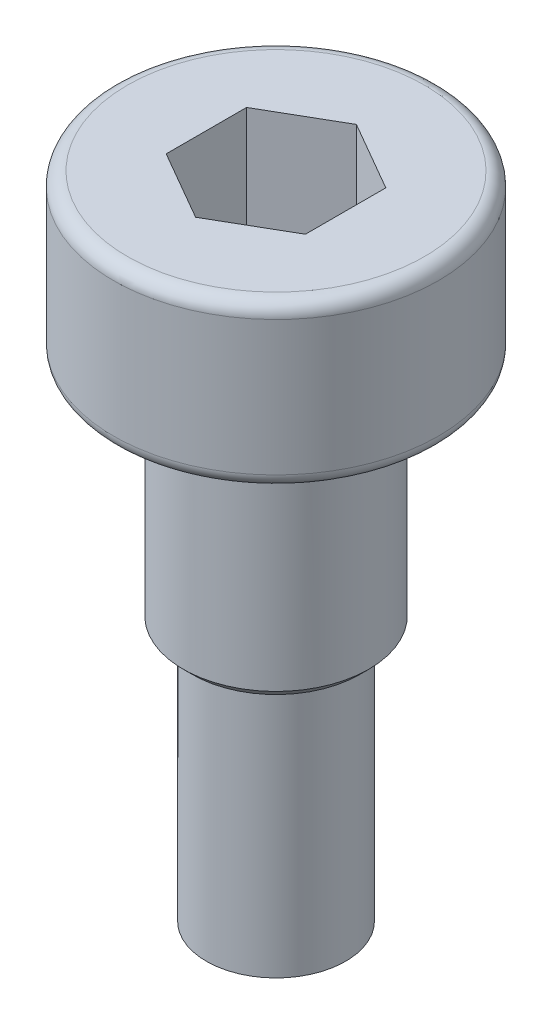
ISO-10303-21;
HEADER;
FILE_DESCRIPTION(('STEP AP214'),'2;1');
FILE_NAME('part.step','',(''),(''),'','','');
FILE_SCHEMA(('AUTOMOTIVE_DESIGN { 1 0 10303 214 1 1 1 1 }'));
ENDSEC;
DATA;
#1=APPLICATION_CONTEXT('core data for automotive mechanical design processes');
#2=APPLICATION_PROTOCOL_DEFINITION('international standard','automotive_design',2000,#1);
#3=PRODUCT_CONTEXT('',#1,'mechanical');
#4=PRODUCT('Part','Part','',(#3));
#5=PRODUCT_RELATED_PRODUCT_CATEGORY('part','',(#4));
#6=PRODUCT_DEFINITION_FORMATION('','',#4);
#7=PRODUCT_DEFINITION_CONTEXT('part definition',#1,'design');
#8=PRODUCT_DEFINITION('design','',#6,#7);
#9=PRODUCT_DEFINITION_SHAPE('','',#8);
#10=(LENGTH_UNIT() NAMED_UNIT(*) SI_UNIT(.MILLI.,.METRE.));
#11=(NAMED_UNIT(*) PLANE_ANGLE_UNIT() SI_UNIT($,.RADIAN.));
#12=(NAMED_UNIT(*) SI_UNIT($,.STERADIAN.) SOLID_ANGLE_UNIT());
#13=UNCERTAINTY_MEASURE_WITH_UNIT(LENGTH_MEASURE(1.E-05),#10,'distance_accuracy_value','');
#14=(GEOMETRIC_REPRESENTATION_CONTEXT(3) GLOBAL_UNCERTAINTY_ASSIGNED_CONTEXT((#13)) GLOBAL_UNIT_ASSIGNED_CONTEXT((#10,
#11,#12)) REPRESENTATION_CONTEXT('',''));
#15=CARTESIAN_POINT('',(0.,0.,0.));
#16=DIRECTION('',(0.,0.,1.));
#17=DIRECTION('',(1.,0.,0.));
#18=AXIS2_PLACEMENT_3D('',#15,#16,#17);
#19=CARTESIAN_POINT('',(0.,3.5,0.));
#20=DIRECTION('',(0.,1.,0.));
#21=DIRECTION('',(-1.,0.,0.));
#22=AXIS2_PLACEMENT_3D('',#19,#20,#21);
#23=PLANE('',#22);
#24=DIRECTION('',(0.866025403784439,0.,-0.5));
#25=VECTOR('',#24,1.);
#26=CARTESIAN_POINT('',(0.,3.5,1.73205080756888));
#27=LINE('',#26,#25);
#28=CARTESIAN_POINT('',(0.,3.5,1.73205080756888));
#29=VERTEX_POINT('',#28);
#30=CARTESIAN_POINT('',(1.5,3.5,0.866025403784439));
#31=VERTEX_POINT('',#30);
#32=EDGE_CURVE('E59',#29,#31,#27,.T.);
#33=ORIENTED_EDGE('',*,*,#32,.F.);
#34=DIRECTION('',(0.866025403784438,0.,0.5));
#35=VECTOR('',#34,1.);
#36=CARTESIAN_POINT('',(-1.5,3.5,0.866025403784438));
#37=LINE('',#36,#35);
#38=CARTESIAN_POINT('',(-1.5,3.5,0.866025403784438));
#39=VERTEX_POINT('',#38);
#40=EDGE_CURVE('E142',#39,#29,#37,.T.);
#41=ORIENTED_EDGE('',*,*,#40,.F.);
#42=DIRECTION('',(0.,0.,1.));
#43=VECTOR('',#42,1.);
#44=CARTESIAN_POINT('',(-1.5,3.5,-0.866025403784439));
#45=LINE('',#44,#43);
#46=CARTESIAN_POINT('',(-1.5,3.5,-0.866025403784439));
#47=VERTEX_POINT('',#46);
#48=EDGE_CURVE('E140',#47,#39,#45,.T.);
#49=ORIENTED_EDGE('',*,*,#48,.F.);
#50=DIRECTION('',(-0.866025403784439,0.,0.5));
#51=VECTOR('',#50,1.);
#52=CARTESIAN_POINT('',(0.,3.5,-1.73205080756888));
#53=LINE('',#52,#51);
#54=CARTESIAN_POINT('',(0.,3.5,-1.73205080756888));
#55=VERTEX_POINT('',#54);
#56=EDGE_CURVE('E107',#55,#47,#53,.T.);
#57=ORIENTED_EDGE('',*,*,#56,.F.);
#58=DIRECTION('',(-0.866025403784439,0.,-0.5));
#59=VECTOR('',#58,1.);
#60=CARTESIAN_POINT('',(1.5,3.5,-0.866025403784439));
#61=LINE('',#60,#59);
#62=CARTESIAN_POINT('',(1.5,3.5,-0.866025403784439));
#63=VERTEX_POINT('',#62);
#64=EDGE_CURVE('E136',#63,#55,#61,.T.);
#65=ORIENTED_EDGE('',*,*,#64,.F.);
#66=DIRECTION('',(0.,0.,-1.));
#67=VECTOR('',#66,1.);
#68=CARTESIAN_POINT('',(1.5,3.5,0.866025403784439));
#69=LINE('',#68,#67);
#70=EDGE_CURVE('E133',#31,#63,#69,.T.);
#71=ORIENTED_EDGE('',*,*,#70,.F.);
#72=EDGE_LOOP('',(#33,#41,#49,#57,#65,#71));
#73=FACE_BOUND('',#72,.T.);
#74=CARTESIAN_POINT('',(0.,3.5,0.));
#75=DIRECTION('',(0.,1.,0.));
#76=DIRECTION('',(-1.,0.,0.));
#77=AXIS2_PLACEMENT_3D('',#74,#75,#76);
#78=CIRCLE('',#77,3.2);
#79=CARTESIAN_POINT('',(-3.2,3.5,0.));
#80=VERTEX_POINT('',#79);
#81=EDGE_CURVE('E169',#80,#80,#78,.T.);
#82=ORIENTED_EDGE('',*,*,#81,.T.);
#83=EDGE_LOOP('',(#82));
#84=FACE_BOUND('',#83,.T.);
#85=ADVANCED_FACE('F43',(#73,#84),#23,.T.);
#86=CARTESIAN_POINT('',(0.,3.5,0.));
#87=DIRECTION('',(0.,1.,0.));
#88=DIRECTION('',(-1.,0.,0.));
#89=AXIS2_PLACEMENT_3D('',#86,#87,#88);
#90=CYLINDRICAL_SURFACE('',#89,3.5);
#91=CARTESIAN_POINT('',(0.,0.3,0.));
#92=DIRECTION('',(0.,-1.,0.));
#93=DIRECTION('',(1.,0.,0.));
#94=AXIS2_PLACEMENT_3D('',#91,#92,#93);
#95=CIRCLE('',#94,3.5);
#96=CARTESIAN_POINT('',(3.5,0.3,0.));
#97=VERTEX_POINT('',#96);
#98=EDGE_CURVE('E163',#97,#97,#95,.F.);
#99=ORIENTED_EDGE('',*,*,#98,.T.);
#100=EDGE_LOOP('',(#99));
#101=FACE_BOUND('',#100,.T.);
#102=CARTESIAN_POINT('',(0.,3.2,0.));
#103=DIRECTION('',(0.,1.,0.));
#104=DIRECTION('',(-1.,0.,0.));
#105=AXIS2_PLACEMENT_3D('',#102,#103,#104);
#106=CIRCLE('',#105,3.5);
#107=CARTESIAN_POINT('',(-3.5,3.2,0.));
#108=VERTEX_POINT('',#107);
#109=EDGE_CURVE('E160',#108,#108,#106,.F.);
#110=ORIENTED_EDGE('',*,*,#109,.T.);
#111=EDGE_LOOP('',(#110));
#112=FACE_BOUND('',#111,.T.);
#113=ADVANCED_FACE('F186',(#101,#112),#90,.T.);
#114=CARTESIAN_POINT('',(-3.5,0.,0.));
#115=DIRECTION('',(0.,-1.,0.));
#116=DIRECTION('',(1.,0.,0.));
#117=AXIS2_PLACEMENT_3D('',#114,#115,#116);
#118=PLANE('',#117);
#119=CARTESIAN_POINT('',(0.,0.,0.));
#120=DIRECTION('',(0.,-1.,0.));
#121=DIRECTION('',(1.,0.,0.));
#122=AXIS2_PLACEMENT_3D('',#119,#120,#121);
#123=CIRCLE('',#122,3.2);
#124=CARTESIAN_POINT('',(3.2,0.,0.));
#125=VERTEX_POINT('',#124);
#126=EDGE_CURVE('E166',#125,#125,#123,.T.);
#127=ORIENTED_EDGE('',*,*,#126,.T.);
#128=EDGE_LOOP('',(#127));
#129=FACE_BOUND('',#128,.T.);
#130=CARTESIAN_POINT('',(0.,0.,0.));
#131=DIRECTION('',(0.,1.,0.));
#132=DIRECTION('',(-1.,0.,0.));
#133=AXIS2_PLACEMENT_3D('',#130,#131,#132);
#134=CIRCLE('',#133,2.);
#135=CARTESIAN_POINT('',(-2.,0.,0.));
#136=VERTEX_POINT('',#135);
#137=EDGE_CURVE('E157',#136,#136,#134,.T.);
#138=ORIENTED_EDGE('',*,*,#137,.T.);
#139=EDGE_LOOP('',(#138));
#140=FACE_BOUND('',#139,.T.);
#141=ADVANCED_FACE('F192',(#129,#140),#118,.T.);
#142=CARTESIAN_POINT('',(0.,3.5,0.));
#143=DIRECTION('',(0.,1.,0.));
#144=DIRECTION('',(-1.,0.,0.));
#145=AXIS2_PLACEMENT_3D('',#142,#143,#144);
#146=CYLINDRICAL_SURFACE('',#145,2.);
#147=CARTESIAN_POINT('',(0.,-4.8,0.));
#148=DIRECTION('',(0.,-1.,0.));
#149=DIRECTION('',(1.,0.,0.));
#150=AXIS2_PLACEMENT_3D('',#147,#148,#149);
#151=CIRCLE('',#150,2.);
#152=CARTESIAN_POINT('',(2.,-4.8,0.));
#153=VERTEX_POINT('',#152);
#154=EDGE_CURVE('E52',#153,#153,#151,.F.);
#155=ORIENTED_EDGE('',*,*,#154,.T.);
#156=EDGE_LOOP('',(#155));
#157=FACE_BOUND('',#156,.T.);
#158=ORIENTED_EDGE('',*,*,#137,.F.);
#159=EDGE_LOOP('',(#158));
#160=FACE_BOUND('',#159,.T.);
#161=ADVANCED_FACE('F174',(#157,#160),#146,.T.);
#162=CARTESIAN_POINT('',(-2.,-5.,0.));
#163=DIRECTION('',(0.,-1.,0.));
#164=DIRECTION('',(1.,0.,0.));
#165=AXIS2_PLACEMENT_3D('',#162,#163,#164);
#166=PLANE('',#165);
#167=CARTESIAN_POINT('',(0.,-5.,0.));
#168=DIRECTION('',(0.,-1.,0.));
#169=DIRECTION('',(1.,0.,0.));
#170=AXIS2_PLACEMENT_3D('',#167,#168,#169);
#171=CIRCLE('',#170,1.8);
#172=CARTESIAN_POINT('',(1.8,-5.,0.));
#173=VERTEX_POINT('',#172);
#174=EDGE_CURVE('E11',#173,#173,#171,.T.);
#175=ORIENTED_EDGE('',*,*,#174,.T.);
#176=EDGE_LOOP('',(#175));
#177=FACE_BOUND('',#176,.T.);
#178=CARTESIAN_POINT('',(0.,-5.,0.));
#179=DIRECTION('',(0.,1.,0.));
#180=DIRECTION('',(-1.,0.,0.));
#181=AXIS2_PLACEMENT_3D('',#178,#179,#180);
#182=CIRCLE('',#181,1.5);
#183=CARTESIAN_POINT('',(-1.5,-5.,0.));
#184=VERTEX_POINT('',#183);
#185=EDGE_CURVE('E154',#184,#184,#182,.T.);
#186=ORIENTED_EDGE('',*,*,#185,.T.);
#187=EDGE_LOOP('',(#186));
#188=FACE_BOUND('',#187,.T.);
#189=ADVANCED_FACE('F228',(#177,#188),#166,.T.);
#190=CARTESIAN_POINT('',(0.,3.5,0.));
#191=DIRECTION('',(0.,1.,0.));
#192=DIRECTION('',(-1.,0.,0.));
#193=AXIS2_PLACEMENT_3D('',#190,#191,#192);
#194=CYLINDRICAL_SURFACE('',#193,1.5);
#195=CARTESIAN_POINT('',(0.,-10.5,0.));
#196=DIRECTION('',(0.,1.,0.));
#197=DIRECTION('',(-1.,0.,0.));
#198=AXIS2_PLACEMENT_3D('',#195,#196,#197);
#199=CIRCLE('',#198,1.5);
#200=CARTESIAN_POINT('',(-1.5,-10.5,0.));
#201=VERTEX_POINT('',#200);
#202=EDGE_CURVE('E146',#201,#201,#199,.T.);
#203=ORIENTED_EDGE('',*,*,#202,.T.);
#204=EDGE_LOOP('',(#203));
#205=FACE_BOUND('',#204,.T.);
#206=ORIENTED_EDGE('',*,*,#185,.F.);
#207=EDGE_LOOP('',(#206));
#208=FACE_BOUND('',#207,.T.);
#209=ADVANCED_FACE('F224',(#205,#208),#194,.T.);
#210=CARTESIAN_POINT('',(-1.5,-10.5,0.));
#211=DIRECTION('',(0.,-1.,0.));
#212=DIRECTION('',(1.,0.,0.));
#213=AXIS2_PLACEMENT_3D('',#210,#211,#212);
#214=PLANE('',#213);
#215=ORIENTED_EDGE('',*,*,#202,.F.);
#216=EDGE_LOOP('',(#215));
#217=FACE_BOUND('',#216,.T.);
#218=ADVANCED_FACE('F201',(#217),#214,.T.);
#219=CARTESIAN_POINT('',(0.,0.3,0.));
#220=DIRECTION('',(0.,-1.,0.));
#221=DIRECTION('',(1.,0.,0.));
#222=AXIS2_PLACEMENT_3D('',#219,#220,#221);
#223=TOROIDAL_SURFACE('',#222,3.2,0.3);
#224=ORIENTED_EDGE('',*,*,#126,.F.);
#225=EDGE_LOOP('',(#224));
#226=FACE_BOUND('',#225,.T.);
#227=ORIENTED_EDGE('',*,*,#98,.F.);
#228=EDGE_LOOP('',(#227));
#229=FACE_BOUND('',#228,.T.);
#230=ADVANCED_FACE('F198',(#226,#229),#223,.T.);
#231=CARTESIAN_POINT('',(0.,3.2,0.));
#232=DIRECTION('',(0.,1.,0.));
#233=DIRECTION('',(-1.,0.,0.));
#234=AXIS2_PLACEMENT_3D('',#231,#232,#233);
#235=TOROIDAL_SURFACE('',#234,3.2,0.3);
#236=ORIENTED_EDGE('',*,*,#109,.F.);
#237=EDGE_LOOP('',(#236));
#238=FACE_BOUND('',#237,.T.);
#239=ORIENTED_EDGE('',*,*,#81,.F.);
#240=EDGE_LOOP('',(#239));
#241=FACE_BOUND('',#240,.T.);
#242=ADVANCED_FACE('F200',(#238,#241),#235,.T.);
#243=CARTESIAN_POINT('',(0.,1.1,1.73205080756888));
#244=DIRECTION('',(0.5,0.,0.866025403784439));
#245=DIRECTION('',(0.866025403784439,0.,-0.5));
#246=AXIS2_PLACEMENT_3D('',#243,#244,#245);
#247=PLANE('',#246);
#248=ORIENTED_EDGE('',*,*,#32,.T.);
#249=DIRECTION('',(0.,1.,0.));
#250=VECTOR('',#249,1.);
#251=CARTESIAN_POINT('',(1.5,1.1,0.866025403784439));
#252=LINE('',#251,#250);
#253=CARTESIAN_POINT('',(1.5,1.1,0.866025403784439));
#254=VERTEX_POINT('',#253);
#255=EDGE_CURVE('E89',#254,#31,#252,.T.);
#256=ORIENTED_EDGE('',*,*,#255,.F.);
#257=DIRECTION('',(0.866025403784439,0.,-0.5));
#258=VECTOR('',#257,1.);
#259=CARTESIAN_POINT('',(0.,1.1,1.73205080756888));
#260=LINE('',#259,#258);
#261=CARTESIAN_POINT('',(0.,1.1,1.73205080756888));
#262=VERTEX_POINT('',#261);
#263=EDGE_CURVE('E144',#262,#254,#260,.T.);
#264=ORIENTED_EDGE('',*,*,#263,.F.);
#265=DIRECTION('',(0.,1.,0.));
#266=VECTOR('',#265,1.);
#267=CARTESIAN_POINT('',(0.,1.1,1.73205080756888));
#268=LINE('',#267,#266);
#269=EDGE_CURVE('E67',#262,#29,#268,.T.);
#270=ORIENTED_EDGE('',*,*,#269,.T.);
#271=EDGE_LOOP('',(#248,#256,#264,#270));
#272=FACE_BOUND('',#271,.T.);
#273=ADVANCED_FACE('F204',(#272),#247,.F.);
#274=CARTESIAN_POINT('',(-1.5,1.1,0.866025403784438));
#275=DIRECTION('',(-0.5,0.,0.866025403784439));
#276=DIRECTION('',(0.866025403784439,0.,0.5));
#277=AXIS2_PLACEMENT_3D('',#274,#275,#276);
#278=PLANE('',#277);
#279=ORIENTED_EDGE('',*,*,#40,.T.);
#280=ORIENTED_EDGE('',*,*,#269,.F.);
#281=DIRECTION('',(0.866025403784438,0.,0.5));
#282=VECTOR('',#281,1.);
#283=CARTESIAN_POINT('',(-1.5,1.1,0.866025403784438));
#284=LINE('',#283,#282);
#285=CARTESIAN_POINT('',(-1.5,1.1,0.866025403784438));
#286=VERTEX_POINT('',#285);
#287=EDGE_CURVE('E119',#286,#262,#284,.T.);
#288=ORIENTED_EDGE('',*,*,#287,.F.);
#289=DIRECTION('',(0.,1.,0.));
#290=VECTOR('',#289,1.);
#291=CARTESIAN_POINT('',(-1.5,1.1,0.866025403784438));
#292=LINE('',#291,#290);
#293=EDGE_CURVE('E111',#286,#39,#292,.T.);
#294=ORIENTED_EDGE('',*,*,#293,.T.);
#295=EDGE_LOOP('',(#279,#280,#288,#294));
#296=FACE_BOUND('',#295,.T.);
#297=ADVANCED_FACE('F209',(#296),#278,.F.);
#298=CARTESIAN_POINT('',(-1.5,1.1,-0.866025403784439));
#299=DIRECTION('',(-1.,0.,0.));
#300=DIRECTION('',(0.,-1.,0.));
#301=AXIS2_PLACEMENT_3D('',#298,#299,#300);
#302=PLANE('',#301);
#303=ORIENTED_EDGE('',*,*,#48,.T.);
#304=ORIENTED_EDGE('',*,*,#293,.F.);
#305=DIRECTION('',(0.,0.,1.));
#306=VECTOR('',#305,1.);
#307=CARTESIAN_POINT('',(-1.5,1.1,-0.866025403784439));
#308=LINE('',#307,#306);
#309=CARTESIAN_POINT('',(-1.5,1.1,-0.866025403784439));
#310=VERTEX_POINT('',#309);
#311=EDGE_CURVE('E115',#310,#286,#308,.T.);
#312=ORIENTED_EDGE('',*,*,#311,.F.);
#313=DIRECTION('',(0.,1.,0.));
#314=VECTOR('',#313,1.);
#315=CARTESIAN_POINT('',(-1.5,1.1,-0.866025403784439));
#316=LINE('',#315,#314);
#317=EDGE_CURVE('E100',#310,#47,#316,.T.);
#318=ORIENTED_EDGE('',*,*,#317,.T.);
#319=EDGE_LOOP('',(#303,#304,#312,#318));
#320=FACE_BOUND('',#319,.T.);
#321=ADVANCED_FACE('F116',(#320),#302,.F.);
#322=CARTESIAN_POINT('',(0.,1.1,-1.73205080756888));
#323=DIRECTION('',(-0.5,0.,-0.866025403784439));
#324=DIRECTION('',(-0.866025403784439,0.,0.5));
#325=AXIS2_PLACEMENT_3D('',#322,#323,#324);
#326=PLANE('',#325);
#327=ORIENTED_EDGE('',*,*,#56,.T.);
#328=ORIENTED_EDGE('',*,*,#317,.F.);
#329=DIRECTION('',(-0.866025403784439,0.,0.5));
#330=VECTOR('',#329,1.);
#331=CARTESIAN_POINT('',(0.,1.1,-1.73205080756888));
#332=LINE('',#331,#330);
#333=CARTESIAN_POINT('',(0.,1.1,-1.73205080756888));
#334=VERTEX_POINT('',#333);
#335=EDGE_CURVE('E104',#334,#310,#332,.T.);
#336=ORIENTED_EDGE('',*,*,#335,.F.);
#337=DIRECTION('',(0.,1.,0.));
#338=VECTOR('',#337,1.);
#339=CARTESIAN_POINT('',(0.,1.1,-1.73205080756888));
#340=LINE('',#339,#338);
#341=EDGE_CURVE('E112',#334,#55,#340,.T.);
#342=ORIENTED_EDGE('',*,*,#341,.T.);
#343=EDGE_LOOP('',(#327,#328,#336,#342));
#344=FACE_BOUND('',#343,.T.);
#345=ADVANCED_FACE('F102',(#344),#326,.F.);
#346=CARTESIAN_POINT('',(1.5,1.1,-0.866025403784439));
#347=DIRECTION('',(0.5,0.,-0.866025403784439));
#348=DIRECTION('',(-0.866025403784439,0.,-0.5));
#349=AXIS2_PLACEMENT_3D('',#346,#347,#348);
#350=PLANE('',#349);
#351=ORIENTED_EDGE('',*,*,#64,.T.);
#352=ORIENTED_EDGE('',*,*,#341,.F.);
#353=DIRECTION('',(-0.866025403784439,0.,-0.5));
#354=VECTOR('',#353,1.);
#355=CARTESIAN_POINT('',(1.5,1.1,-0.866025403784439));
#356=LINE('',#355,#354);
#357=CARTESIAN_POINT('',(1.5,1.1,-0.866025403784439));
#358=VERTEX_POINT('',#357);
#359=EDGE_CURVE('E125',#358,#334,#356,.T.);
#360=ORIENTED_EDGE('',*,*,#359,.F.);
#361=DIRECTION('',(0.,1.,0.));
#362=VECTOR('',#361,1.);
#363=CARTESIAN_POINT('',(1.5,1.1,-0.866025403784439));
#364=LINE('',#363,#362);
#365=EDGE_CURVE('E149',#358,#63,#364,.T.);
#366=ORIENTED_EDGE('',*,*,#365,.T.);
#367=EDGE_LOOP('',(#351,#352,#360,#366));
#368=FACE_BOUND('',#367,.T.);
#369=ADVANCED_FACE('F308',(#368),#350,.F.);
#370=CARTESIAN_POINT('',(1.5,1.1,0.866025403784439));
#371=DIRECTION('',(1.,0.,0.));
#372=DIRECTION('',(0.,1.,0.));
#373=AXIS2_PLACEMENT_3D('',#370,#371,#372);
#374=PLANE('',#373);
#375=ORIENTED_EDGE('',*,*,#70,.T.);
#376=ORIENTED_EDGE('',*,*,#365,.F.);
#377=DIRECTION('',(0.,0.,-1.));
#378=VECTOR('',#377,1.);
#379=CARTESIAN_POINT('',(1.5,1.1,0.866025403784439));
#380=LINE('',#379,#378);
#381=EDGE_CURVE('E127',#254,#358,#380,.T.);
#382=ORIENTED_EDGE('',*,*,#381,.F.);
#383=ORIENTED_EDGE('',*,*,#255,.T.);
#384=EDGE_LOOP('',(#375,#376,#382,#383));
#385=FACE_BOUND('',#384,.T.);
#386=ADVANCED_FACE('F182',(#385),#374,.F.);
#387=CARTESIAN_POINT('',(0.,1.1,0.));
#388=DIRECTION('',(0.,1.,0.));
#389=DIRECTION('',(0.,0.,1.));
#390=AXIS2_PLACEMENT_3D('',#387,#388,#389);
#391=PLANE('',#390);
#392=ORIENTED_EDGE('',*,*,#263,.T.);
#393=ORIENTED_EDGE('',*,*,#381,.T.);
#394=ORIENTED_EDGE('',*,*,#359,.T.);
#395=ORIENTED_EDGE('',*,*,#335,.T.);
#396=ORIENTED_EDGE('',*,*,#311,.T.);
#397=ORIENTED_EDGE('',*,*,#287,.T.);
#398=EDGE_LOOP('',(#392,#393,#394,#395,#396,#397));
#399=FACE_BOUND('',#398,.T.);
#400=ADVANCED_FACE('F122',(#399),#391,.T.);
#401=CARTESIAN_POINT('',(0.,-4.8,0.));
#402=DIRECTION('',(0.,1.,0.));
#403=DIRECTION('',(-1.,0.,0.));
#404=AXIS2_PLACEMENT_3D('',#401,#402,#403);
#405=CONICAL_SURFACE('',#404,2.,0.785398163397451);
#406=ORIENTED_EDGE('',*,*,#174,.F.);
#407=EDGE_LOOP('',(#406));
#408=FACE_BOUND('',#407,.T.);
#409=ORIENTED_EDGE('',*,*,#154,.F.);
#410=EDGE_LOOP('',(#409));
#411=FACE_BOUND('',#410,.T.);
#412=ADVANCED_FACE('F46',(#408,#411),#405,.T.);
#413=CLOSED_SHELL('',(#85,#113,#141,#161,#189,#209,#218,#230,#242,#273,#297,#321,#345,#369,#386,
#400,#412));
#414=MANIFOLD_SOLID_BREP('B2',#413);
#415=ADVANCED_BREP_SHAPE_REPRESENTATION('',(#18,#414),#14);
#416=SHAPE_DEFINITION_REPRESENTATION(#9,#415);
ENDSEC;
END-ISO-10303-21;
